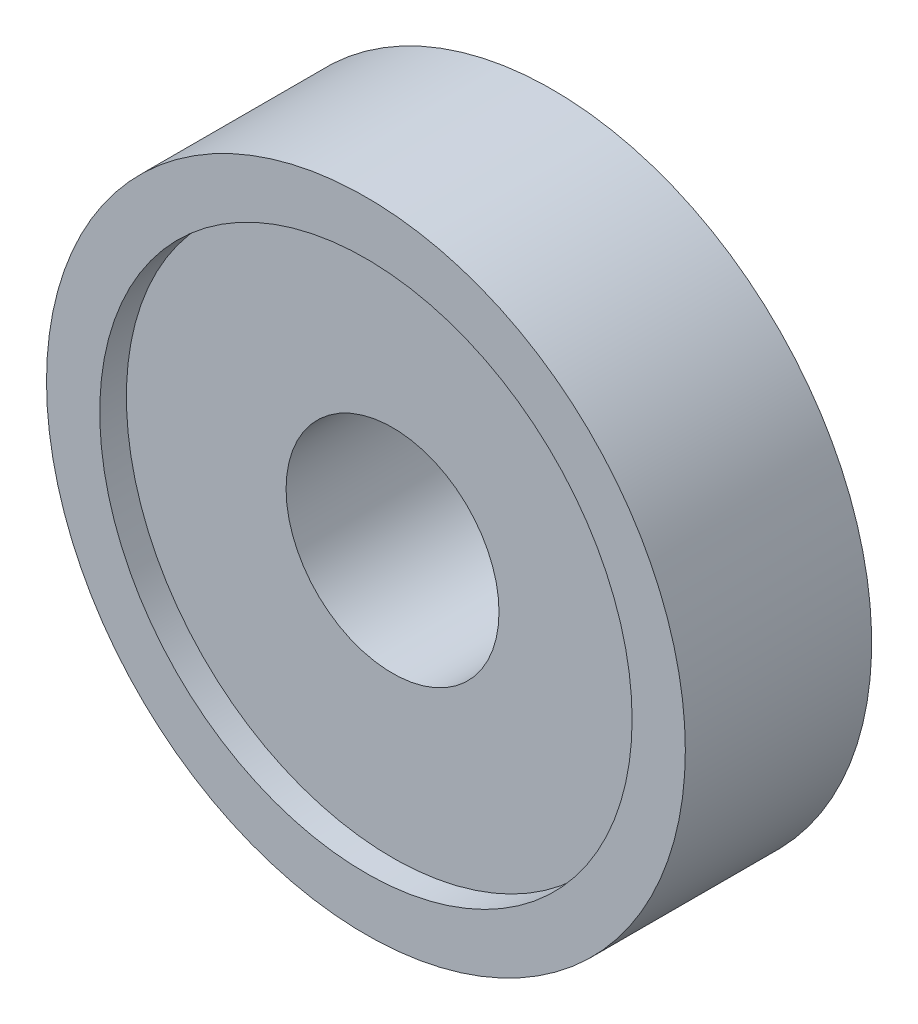
ISO-10303-21;
HEADER;
FILE_DESCRIPTION(('STEP AP214'),'2;1');
FILE_NAME('part.step','',(''),(''),'','','');
FILE_SCHEMA(('AUTOMOTIVE_DESIGN { 1 0 10303 214 1 1 1 1 }'));
ENDSEC;
DATA;
#1=APPLICATION_CONTEXT('core data for automotive mechanical design processes');
#2=APPLICATION_PROTOCOL_DEFINITION('international standard','automotive_design',2000,#1);
#3=PRODUCT_CONTEXT('',#1,'mechanical');
#4=PRODUCT('Part','Part','',(#3));
#5=PRODUCT_RELATED_PRODUCT_CATEGORY('part','',(#4));
#6=PRODUCT_DEFINITION_FORMATION('','',#4);
#7=PRODUCT_DEFINITION_CONTEXT('part definition',#1,'design');
#8=PRODUCT_DEFINITION('design','',#6,#7);
#9=PRODUCT_DEFINITION_SHAPE('','',#8);
#10=(LENGTH_UNIT() NAMED_UNIT(*) SI_UNIT(.MILLI.,.METRE.));
#11=(NAMED_UNIT(*) PLANE_ANGLE_UNIT() SI_UNIT($,.RADIAN.));
#12=(NAMED_UNIT(*) SI_UNIT($,.STERADIAN.) SOLID_ANGLE_UNIT());
#13=UNCERTAINTY_MEASURE_WITH_UNIT(LENGTH_MEASURE(1.E-05),#10,'distance_accuracy_value','');
#14=(GEOMETRIC_REPRESENTATION_CONTEXT(3) GLOBAL_UNCERTAINTY_ASSIGNED_CONTEXT((#13)) GLOBAL_UNIT_ASSIGNED_CONTEXT((#10,
#11,#12)) REPRESENTATION_CONTEXT('',''));
#15=CARTESIAN_POINT('',(0.,0.,0.));
#16=DIRECTION('',(0.,0.,1.));
#17=DIRECTION('',(1.,0.,0.));
#18=AXIS2_PLACEMENT_3D('',#15,#16,#17);
#19=CARTESIAN_POINT('',(0.,0.,1.));
#20=DIRECTION('',(0.,0.,1.));
#21=DIRECTION('',(1.,0.,0.));
#22=AXIS2_PLACEMENT_3D('',#19,#20,#21);
#23=PLANE('',#22);
#24=CARTESIAN_POINT('',(0.,0.,1.));
#25=DIRECTION('',(0.,0.,1.));
#26=DIRECTION('',(1.,0.,0.));
#27=AXIS2_PLACEMENT_3D('',#24,#25,#26);
#28=CIRCLE('',#27,12.);
#29=CARTESIAN_POINT('',(12.,0.,1.));
#30=VERTEX_POINT('',#29);
#31=EDGE_CURVE('E10',#30,#30,#28,.T.);
#32=ORIENTED_EDGE('',*,*,#31,.T.);
#33=EDGE_LOOP('',(#32));
#34=FACE_BOUND('',#33,.T.);
#35=CARTESIAN_POINT('',(0.,0.,1.));
#36=DIRECTION('',(0.,0.,1.));
#37=DIRECTION('',(1.,0.,0.));
#38=AXIS2_PLACEMENT_3D('',#35,#36,#37);
#39=CIRCLE('',#38,10.);
#40=CARTESIAN_POINT('',(10.,0.,1.));
#41=VERTEX_POINT('',#40);
#42=EDGE_CURVE('E45',#41,#41,#39,.T.);
#43=ORIENTED_EDGE('',*,*,#42,.F.);
#44=EDGE_LOOP('',(#43));
#45=FACE_BOUND('',#44,.T.);
#46=ADVANCED_FACE('F37',(#34,#45),#23,.T.);
#47=CARTESIAN_POINT('',(0.,0.,1.));
#48=DIRECTION('',(0.,0.,-1.));
#49=DIRECTION('',(-1.,0.,0.));
#50=AXIS2_PLACEMENT_3D('',#47,#48,#49);
#51=CYLINDRICAL_SURFACE('',#50,12.);
#52=ORIENTED_EDGE('',*,*,#31,.F.);
#53=EDGE_LOOP('',(#52));
#54=FACE_BOUND('',#53,.T.);
#55=CARTESIAN_POINT('',(0.,0.,-6.));
#56=DIRECTION('',(0.,0.,-1.));
#57=DIRECTION('',(-1.,0.,0.));
#58=AXIS2_PLACEMENT_3D('',#55,#56,#57);
#59=CIRCLE('',#58,12.);
#60=CARTESIAN_POINT('',(-12.,0.,-6.));
#61=VERTEX_POINT('',#60);
#62=EDGE_CURVE('E53',#61,#61,#59,.T.);
#63=ORIENTED_EDGE('',*,*,#62,.F.);
#64=EDGE_LOOP('',(#63));
#65=FACE_BOUND('',#64,.T.);
#66=ADVANCED_FACE('F39',(#54,#65),#51,.T.);
#67=CARTESIAN_POINT('',(0.,0.,1.));
#68=DIRECTION('',(0.,0.,-1.));
#69=DIRECTION('',(-1.,0.,0.));
#70=AXIS2_PLACEMENT_3D('',#67,#68,#69);
#71=CYLINDRICAL_SURFACE('',#70,10.);
#72=ORIENTED_EDGE('',*,*,#42,.T.);
#73=EDGE_LOOP('',(#72));
#74=FACE_BOUND('',#73,.T.);
#75=CARTESIAN_POINT('',(0.,0.,0.));
#76=DIRECTION('',(0.,0.,1.));
#77=DIRECTION('',(1.,0.,0.));
#78=AXIS2_PLACEMENT_3D('',#75,#76,#77);
#79=CIRCLE('',#78,10.);
#80=CARTESIAN_POINT('',(10.,0.,0.));
#81=VERTEX_POINT('',#80);
#82=EDGE_CURVE('E49',#81,#81,#79,.T.);
#83=ORIENTED_EDGE('',*,*,#82,.F.);
#84=EDGE_LOOP('',(#83));
#85=FACE_BOUND('',#84,.T.);
#86=ADVANCED_FACE('F74',(#74,#85),#71,.F.);
#87=CARTESIAN_POINT('',(0.,0.,0.));
#88=DIRECTION('',(0.,0.,-1.));
#89=DIRECTION('',(-1.,0.,0.));
#90=AXIS2_PLACEMENT_3D('',#87,#88,#89);
#91=PLANE('',#90);
#92=CARTESIAN_POINT('',(0.,0.,0.));
#93=DIRECTION('',(0.,0.,1.));
#94=DIRECTION('',(1.,0.,0.));
#95=AXIS2_PLACEMENT_3D('',#92,#93,#94);
#96=CIRCLE('',#95,4.);
#97=CARTESIAN_POINT('',(4.,0.,0.));
#98=VERTEX_POINT('',#97);
#99=EDGE_CURVE('E57',#98,#98,#96,.T.);
#100=ORIENTED_EDGE('',*,*,#99,.F.);
#101=EDGE_LOOP('',(#100));
#102=FACE_BOUND('',#101,.T.);
#103=ORIENTED_EDGE('',*,*,#82,.T.);
#104=EDGE_LOOP('',(#103));
#105=FACE_BOUND('',#104,.T.);
#106=ADVANCED_FACE('F69',(#102,#105),#91,.F.);
#107=CARTESIAN_POINT('',(0.,0.,-6.));
#108=DIRECTION('',(0.,0.,-1.));
#109=DIRECTION('',(-1.,0.,0.));
#110=AXIS2_PLACEMENT_3D('',#107,#108,#109);
#111=PLANE('',#110);
#112=CARTESIAN_POINT('',(0.,0.,-6.));
#113=DIRECTION('',(0.,0.,-1.));
#114=DIRECTION('',(-1.,0.,0.));
#115=AXIS2_PLACEMENT_3D('',#112,#113,#114);
#116=CIRCLE('',#115,4.);
#117=CARTESIAN_POINT('',(4.,0.,-6.));
#118=VERTEX_POINT('',#117);
#119=EDGE_CURVE('E41',#118,#118,#116,.T.);
#120=ORIENTED_EDGE('',*,*,#119,.F.);
#121=EDGE_LOOP('',(#120));
#122=FACE_BOUND('',#121,.T.);
#123=ORIENTED_EDGE('',*,*,#62,.T.);
#124=EDGE_LOOP('',(#123));
#125=FACE_BOUND('',#124,.T.);
#126=ADVANCED_FACE('F66',(#122,#125),#111,.T.);
#127=CARTESIAN_POINT('',(0.,0.,-13.));
#128=DIRECTION('',(0.,0.,1.));
#129=DIRECTION('',(1.,0.,0.));
#130=AXIS2_PLACEMENT_3D('',#127,#128,#129);
#131=CYLINDRICAL_SURFACE('',#130,4.);
#132=CARTESIAN_POINT('',(4.,0.,-6.));
#133=CARTESIAN_POINT('',(4.,0.,-5.9375));
#134=CARTESIAN_POINT('',(4.,0.,-5.875));
#135=CARTESIAN_POINT('',(4.,0.,-5.75));
#136=CARTESIAN_POINT('',(4.,0.,-5.6875));
#137=CARTESIAN_POINT('',(4.,0.,-5.5625));
#138=CARTESIAN_POINT('',(4.,0.,-5.5));
#139=CARTESIAN_POINT('',(4.,0.,-5.375));
#140=CARTESIAN_POINT('',(4.,0.,-5.3125));
#141=CARTESIAN_POINT('',(4.,0.,-5.1875));
#142=CARTESIAN_POINT('',(4.,0.,-5.125));
#143=CARTESIAN_POINT('',(4.,0.,-5.));
#144=CARTESIAN_POINT('',(4.,0.,-4.9375));
#145=CARTESIAN_POINT('',(4.,0.,-4.8125));
#146=CARTESIAN_POINT('',(4.,0.,-4.75));
#147=CARTESIAN_POINT('',(4.,0.,-4.625));
#148=CARTESIAN_POINT('',(4.,0.,-4.5625));
#149=CARTESIAN_POINT('',(4.,0.,-4.4375));
#150=CARTESIAN_POINT('',(4.,0.,-4.375));
#151=CARTESIAN_POINT('',(4.,0.,-4.25));
#152=CARTESIAN_POINT('',(4.,0.,-4.1875));
#153=CARTESIAN_POINT('',(4.,0.,-4.0625));
#154=CARTESIAN_POINT('',(4.,0.,-4.));
#155=CARTESIAN_POINT('',(4.,0.,-3.875));
#156=CARTESIAN_POINT('',(4.,0.,-3.8125));
#157=CARTESIAN_POINT('',(4.,0.,-3.6875));
#158=CARTESIAN_POINT('',(4.,0.,-3.625));
#159=CARTESIAN_POINT('',(4.,0.,-3.5));
#160=CARTESIAN_POINT('',(4.,0.,-3.4375));
#161=CARTESIAN_POINT('',(4.,0.,-3.3125));
#162=CARTESIAN_POINT('',(4.,0.,-3.25));
#163=CARTESIAN_POINT('',(4.,0.,-3.125));
#164=CARTESIAN_POINT('',(4.,0.,-3.0625));
#165=CARTESIAN_POINT('',(4.,0.,-2.9375));
#166=CARTESIAN_POINT('',(4.,0.,-2.875));
#167=CARTESIAN_POINT('',(4.,0.,-2.75));
#168=CARTESIAN_POINT('',(4.,0.,-2.6875));
#169=CARTESIAN_POINT('',(4.,0.,-2.5625));
#170=CARTESIAN_POINT('',(4.,0.,-2.5));
#171=CARTESIAN_POINT('',(4.,0.,-2.375));
#172=CARTESIAN_POINT('',(4.,0.,-2.3125));
#173=CARTESIAN_POINT('',(4.,0.,-2.1875));
#174=CARTESIAN_POINT('',(4.,0.,-2.125));
#175=CARTESIAN_POINT('',(4.,0.,-2.));
#176=CARTESIAN_POINT('',(4.,0.,-1.9375));
#177=CARTESIAN_POINT('',(4.,0.,-1.8125));
#178=CARTESIAN_POINT('',(4.,0.,-1.75));
#179=CARTESIAN_POINT('',(4.,0.,-1.625));
#180=CARTESIAN_POINT('',(4.,0.,-1.5625));
#181=CARTESIAN_POINT('',(4.,0.,-1.4375));
#182=CARTESIAN_POINT('',(4.,0.,-1.375));
#183=CARTESIAN_POINT('',(4.,0.,-1.25));
#184=CARTESIAN_POINT('',(4.,0.,-1.1875));
#185=CARTESIAN_POINT('',(4.,0.,-1.0625));
#186=CARTESIAN_POINT('',(4.,0.,-1.));
#187=CARTESIAN_POINT('',(4.,0.,-0.875000000000003));
#188=CARTESIAN_POINT('',(4.,0.,-0.812500000000002));
#189=CARTESIAN_POINT('',(4.,0.,-0.687500000000002));
#190=CARTESIAN_POINT('',(4.,0.,-0.625000000000002));
#191=CARTESIAN_POINT('',(4.,0.,-0.500000000000002));
#192=CARTESIAN_POINT('',(4.,0.,-0.437500000000002));
#193=CARTESIAN_POINT('',(4.,0.,-0.312500000000002));
#194=CARTESIAN_POINT('',(4.,0.,-0.250000000000002));
#195=CARTESIAN_POINT('',(4.,0.,-0.125000000000002));
#196=CARTESIAN_POINT('',(4.,0.,-0.0625000000000018));
#197=CARTESIAN_POINT('',(4.,0.,0.));
#198=B_SPLINE_CURVE_WITH_KNOTS('',3,(#132,#133,#134,#135,#136,#137,#138,#139,#140,#141,#142,
#143,#144,#145,#146,#147,#148,#149,#150,#151,#152,#153,#154,#155,#156,#157,#158,#159,#160,#161,
#162,#163,#164,#165,#166,#167,#168,#169,#170,#171,#172,#173,#174,#175,#176,#177,#178,#179,#180,
#181,#182,#183,#184,#185,#186,#187,#188,#189,#190,#191,#192,#193,#194,#195,#196,#197),
.UNSPECIFIED.,.F.,.F.,(4,2,2,2,2,2,2,2,2,2,2,2,2,2,2,2,2,2,2,2,2,2,2,2,2,2,2,2,2,2,2,2,4),(0.,
0.1875,0.375,0.5625,0.75,0.937499999999998,1.125,1.3125,1.5,1.6875,1.875,2.0625,2.25,2.4375,
2.625,2.8125,3.,3.1875,3.375,3.5625,3.75,3.9375,4.125,4.3125,4.5,4.6875,4.875,5.0625,5.25,
5.4375,5.625,5.8125,6.),.UNSPECIFIED.);
#199=EDGE_CURVE('BSEAM64',#118,#98,#198,.T.);
#200=ORIENTED_EDGE('',*,*,#119,.T.);
#201=ORIENTED_EDGE('',*,*,#99,.T.);
#202=ORIENTED_EDGE('',*,*,#199,.T.);
#203=ORIENTED_EDGE('',*,*,#199,.F.);
#204=EDGE_LOOP('',(#200,#202,#201,#203));
#205=FACE_BOUND('',#204,.T.);
#206=ADVANCED_FACE('F64',(#205),#131,.F.);
#207=CLOSED_SHELL('',(#46,#66,#86,#106,#126,#206));
#208=MANIFOLD_SOLID_BREP('B2',#207);
#209=ADVANCED_BREP_SHAPE_REPRESENTATION('',(#18,#208),#14);
#210=SHAPE_DEFINITION_REPRESENTATION(#9,#209);
ENDSEC;
END-ISO-10303-21;
